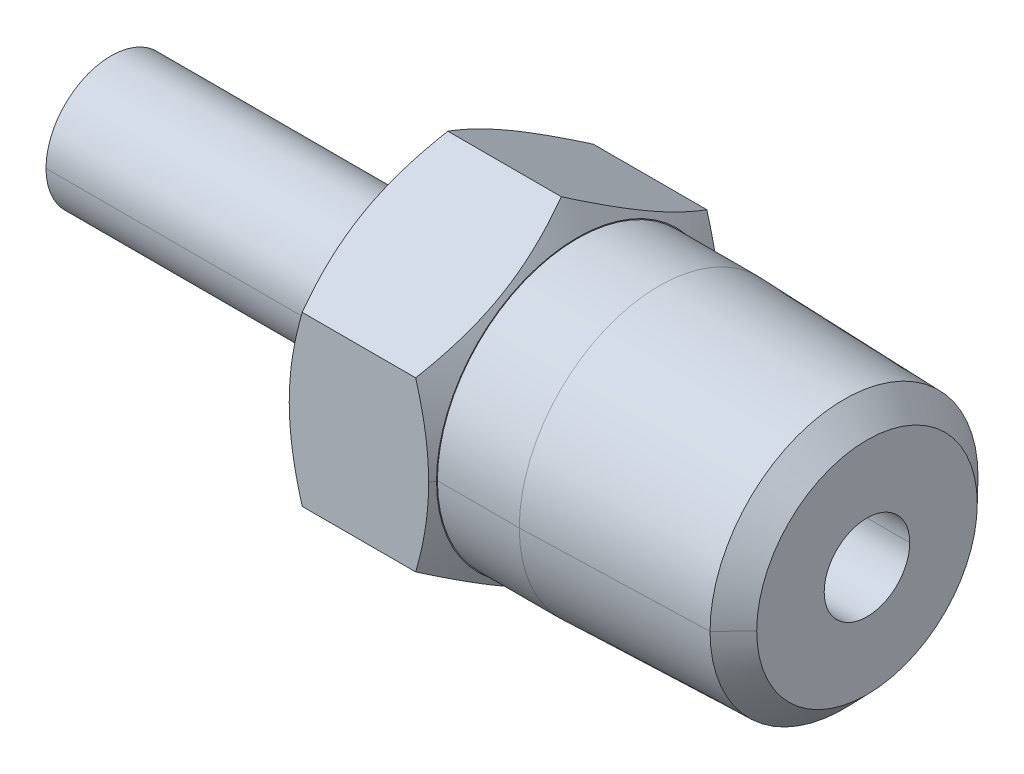
ISO-10303-21;
HEADER;
FILE_DESCRIPTION(('STEP AP214'),'2;1');
FILE_NAME('part.step','',(''),(''),'','','');
FILE_SCHEMA(('AUTOMOTIVE_DESIGN { 1 0 10303 214 1 1 1 1 }'));
ENDSEC;
DATA;
#1=APPLICATION_CONTEXT('core data for automotive mechanical design processes');
#2=APPLICATION_PROTOCOL_DEFINITION('international standard','automotive_design',2000,#1);
#3=PRODUCT_CONTEXT('',#1,'mechanical');
#4=PRODUCT('Part','Part','',(#3));
#5=PRODUCT_RELATED_PRODUCT_CATEGORY('part','',(#4));
#6=PRODUCT_DEFINITION_FORMATION('','',#4);
#7=PRODUCT_DEFINITION_CONTEXT('part definition',#1,'design');
#8=PRODUCT_DEFINITION('design','',#6,#7);
#9=PRODUCT_DEFINITION_SHAPE('','',#8);
#10=(LENGTH_UNIT() NAMED_UNIT(*) SI_UNIT(.MILLI.,.METRE.));
#11=(NAMED_UNIT(*) PLANE_ANGLE_UNIT() SI_UNIT($,.RADIAN.));
#12=(NAMED_UNIT(*) SI_UNIT($,.STERADIAN.) SOLID_ANGLE_UNIT());
#13=UNCERTAINTY_MEASURE_WITH_UNIT(LENGTH_MEASURE(1.E-05),#10,'distance_accuracy_value','');
#14=(GEOMETRIC_REPRESENTATION_CONTEXT(3) GLOBAL_UNCERTAINTY_ASSIGNED_CONTEXT((#13)) GLOBAL_UNIT_ASSIGNED_CONTEXT((#10,
#11,#12)) REPRESENTATION_CONTEXT('',''));
#15=CARTESIAN_POINT('',(0.,0.,0.));
#16=DIRECTION('',(0.,0.,1.));
#17=DIRECTION('',(1.,0.,0.));
#18=AXIS2_PLACEMENT_3D('',#15,#16,#17);
#19=CARTESIAN_POINT('',(0.,-4.12516767335987,7.145));
#20=DIRECTION('',(0.,-0.866025403784439,0.5));
#21=DIRECTION('',(-1.,0.,0.));
#22=AXIS2_PLACEMENT_3D('',#19,#20,#21);
#23=PLANE('',#22);
#24=CARTESIAN_POINT('',(16.5296164759249,-4.12516767335987,7.145));
#25=CARTESIAN_POINT('',(16.2204855706598,-4.66059810746739,6.21760728420712));
#26=CARTESIAN_POINT('',(16.0639197776998,-5.14395831425443,5.38040284769497));
#27=CARTESIAN_POINT('',(15.8921481330481,-5.67426302583439,4.46188814374532));
#28=CARTESIAN_POINT('',(15.8914533259331,-6.18381055232482,3.57932593899285));
#29=CARTESIAN_POINT('',(15.8907556166952,-6.69548639556823,2.69307738148961));
#30=CARTESIAN_POINT('',(16.0630966316208,-7.22899997684672,1.76900475218724));
#31=CARTESIAN_POINT('',(16.2195163074295,-7.71322609945068,0.930300505485105));
#32=CARTESIAN_POINT('',(16.5296164759249,-8.25033534671975,0.));
#33=B_SPLINE_CURVE_WITH_KNOTS('',2,(#24,#25,#26,#27,#28,#29,#30,#31,#32),.UNSPECIFIED.,.F.,.F.,
(3,2,2,2,3),(0.,0.25,0.5,0.75,1.),.UNSPECIFIED.);
#34=CARTESIAN_POINT('',(16.5296164759249,-4.12516767335987,7.145));
#35=VERTEX_POINT('',#34);
#36=CARTESIAN_POINT('',(16.5296164759249,-8.25033534671975,0.));
#37=VERTEX_POINT('',#36);
#38=EDGE_CURVE('E527',#35,#37,#33,.T.);
#39=ORIENTED_EDGE('',*,*,#38,.T.);
#40=DIRECTION('',(1.,0.,0.));
#41=VECTOR('',#40,1.);
#42=CARTESIAN_POINT('',(0.,-8.25033534671975,0.));
#43=LINE('',#42,#41);
#44=CARTESIAN_POINT('',(22.0963835240751,-8.25033534671975,0.));
#45=VERTEX_POINT('',#44);
#46=EDGE_CURVE('E10',#37,#45,#43,.T.);
#47=ORIENTED_EDGE('',*,*,#46,.T.);
#48=CARTESIAN_POINT('',(22.0963835240751,-8.25033534671975,0.));
#49=CARTESIAN_POINT('',(22.405514429361,-7.71490491257609,0.927392715855481));
#50=CARTESIAN_POINT('',(22.5620802223002,-7.2315447058252,1.76459715230502));
#51=CARTESIAN_POINT('',(22.7338518669617,-6.70123999418403,2.68311185636069));
#52=CARTESIAN_POINT('',(22.7345466740668,-6.19169246775481,3.56567406100714));
#53=CARTESIAN_POINT('',(22.7352443832952,-5.68001662445924,4.45192261860071));
#54=CARTESIAN_POINT('',(22.5629033683791,-5.14650304323291,5.37599524781275));
#55=CARTESIAN_POINT('',(22.4064836925557,-4.66227692060334,6.21469949455924));
#56=CARTESIAN_POINT('',(22.0963835240751,-4.12516767335987,7.145));
#57=B_SPLINE_CURVE_WITH_KNOTS('',2,(#48,#49,#50,#51,#52,#53,#54,#55,#56),.UNSPECIFIED.,.F.,.F.,
(3,2,2,2,3),(0.,0.25,0.5,0.75,1.),.UNSPECIFIED.);
#58=CARTESIAN_POINT('',(22.0963835240751,-4.12516767335987,7.145));
#59=VERTEX_POINT('',#58);
#60=EDGE_CURVE('E1067',#45,#59,#57,.T.);
#61=ORIENTED_EDGE('',*,*,#60,.T.);
#62=DIRECTION('',(1.,0.,0.));
#63=VECTOR('',#62,1.);
#64=CARTESIAN_POINT('',(0.,-4.12516767335987,7.145));
#65=LINE('',#64,#63);
#66=EDGE_CURVE('E438',#35,#59,#65,.T.);
#67=ORIENTED_EDGE('',*,*,#66,.F.);
#68=EDGE_LOOP('',(#39,#47,#61,#67));
#69=FACE_BOUND('',#68,.T.);
#70=ADVANCED_FACE('F16',(#69),#23,.T.);
#71=CARTESIAN_POINT('',(0.,-8.25033534671975,0.));
#72=DIRECTION('',(0.,-0.866025403784439,-0.5));
#73=DIRECTION('',(0.,0.5,-0.866025403784439));
#74=AXIS2_PLACEMENT_3D('',#71,#72,#73);
#75=PLANE('',#74);
#76=CARTESIAN_POINT('',(16.5296164759249,-8.25033534671975,0.));
#77=CARTESIAN_POINT('',(16.22048557066,-7.71490491261251,-0.927392715792402));
#78=CARTESIAN_POINT('',(16.0639197776998,-7.2315447058252,-1.76459715230502));
#79=CARTESIAN_POINT('',(15.8921481330416,-6.70123999422544,-2.68311185628897));
#80=CARTESIAN_POINT('',(15.8914533259332,-6.19169246775481,-3.56567406100714));
#81=CARTESIAN_POINT('',(15.8907556167016,-5.68001662449136,-4.45192261854508));
#82=CARTESIAN_POINT('',(16.0630966316208,-5.14650304323291,-5.37599524781275));
#83=CARTESIAN_POINT('',(16.2195163074295,-4.66227692062892,-6.21469949451493));
#84=CARTESIAN_POINT('',(16.5296164759249,-4.12516767335987,-7.14500000000001));
#85=B_SPLINE_CURVE_WITH_KNOTS('',2,(#76,#77,#78,#79,#80,#81,#82,#83,#84),.UNSPECIFIED.,.F.,.F.,
(3,2,2,2,3),(0.,0.25,0.5,0.75,1.),.UNSPECIFIED.);
#86=CARTESIAN_POINT('',(16.5296164759249,-4.12516767335987,-7.145));
#87=VERTEX_POINT('',#86);
#88=EDGE_CURVE('E266',#37,#87,#85,.T.);
#89=ORIENTED_EDGE('',*,*,#88,.T.);
#90=DIRECTION('',(1.,0.,0.));
#91=VECTOR('',#90,1.);
#92=CARTESIAN_POINT('',(0.,-4.12516767335987,-7.145));
#93=LINE('',#92,#91);
#94=CARTESIAN_POINT('',(22.0963835240751,-4.12516767335987,-7.145));
#95=VERTEX_POINT('',#94);
#96=EDGE_CURVE('E30',#87,#95,#93,.T.);
#97=ORIENTED_EDGE('',*,*,#96,.T.);
#98=CARTESIAN_POINT('',(22.0963835240751,-4.12516767335987,-7.14500000000001));
#99=CARTESIAN_POINT('',(22.4055144293611,-4.66059810750354,-6.2176072841445));
#100=CARTESIAN_POINT('',(22.5620802223003,-5.14395831425442,-5.38040284769498));
#101=CARTESIAN_POINT('',(22.7338518669552,-5.67426302587556,-4.46188814367401));
#102=CARTESIAN_POINT('',(22.7345466740669,-6.18381055232481,-3.57932593899285));
#103=CARTESIAN_POINT('',(22.7352443833016,-6.69548639557781,-2.69307738147301));
#104=CARTESIAN_POINT('',(22.5629033683792,-7.22899997684672,-1.76900475218724));
#105=CARTESIAN_POINT('',(22.4064836925708,-7.7132260994502,-0.930300505485926));
#106=CARTESIAN_POINT('',(22.0963835240751,-8.25033534671975,0.));
#107=B_SPLINE_CURVE_WITH_KNOTS('',2,(#98,#99,#100,#101,#102,#103,#104,#105,#106),.UNSPECIFIED.,
.F.,.F.,(3,2,2,2,3),(0.,0.25,0.5,0.75,1.),.UNSPECIFIED.);
#108=EDGE_CURVE('E187',#95,#45,#107,.T.);
#109=ORIENTED_EDGE('',*,*,#108,.T.);
#110=ORIENTED_EDGE('',*,*,#46,.F.);
#111=EDGE_LOOP('',(#89,#97,#109,#110));
#112=FACE_BOUND('',#111,.T.);
#113=ADVANCED_FACE('F237',(#112),#75,.T.);
#114=CARTESIAN_POINT('',(0.,-4.12516767335987,-7.145));
#115=DIRECTION('',(0.,0.,-1.));
#116=DIRECTION('',(-1.,0.,0.));
#117=AXIS2_PLACEMENT_3D('',#114,#115,#116);
#118=PLANE('',#117);
#119=CARTESIAN_POINT('',(16.5296164759249,-4.12516767335987,-7.145));
#120=CARTESIAN_POINT('',(16.2190473357358,-3.04932461321923,-7.145));
#121=CARTESIAN_POINT('',(16.062440766581,-2.07843354247556,-7.145));
#122=CARTESIAN_POINT('',(15.8914508159514,-1.01837190426317,-7.145));
#123=CARTESIAN_POINT('',(15.8914508159514,0.,-7.145));
#124=B_SPLINE_CURVE_WITH_KNOTS('',2,(#119,#120,#121,#122,#123),.UNSPECIFIED.,.F.,.F.,(3,2,3),
(0.,0.5,1.),.UNSPECIFIED.);
#125=CARTESIAN_POINT('',(15.8914508159514,0.,-7.145));
#126=VERTEX_POINT('',#125);
#127=EDGE_CURVE('E276',#87,#126,#124,.T.);
#128=ORIENTED_EDGE('',*,*,#127,.T.);
#129=CARTESIAN_POINT('',(15.8914508159514,0.,-7.145));
#130=CARTESIAN_POINT('',(15.8914508159514,1.02505278060319,-7.145));
#131=CARTESIAN_POINT('',(16.0649185019962,2.09374613059247,-7.145));
#132=CARTESIAN_POINT('',(16.2212824043129,3.05706711788696,-7.145));
#133=CARTESIAN_POINT('',(16.5296164759249,4.12516767335989,-7.145));
#134=B_SPLINE_CURVE_WITH_KNOTS('',2,(#129,#130,#131,#132,#133),.UNSPECIFIED.,.F.,.F.,(3,2,3),
(0.,0.5,1.),.UNSPECIFIED.);
#135=CARTESIAN_POINT('',(16.5296164759249,4.12516767335988,-7.145));
#136=VERTEX_POINT('',#135);
#137=EDGE_CURVE('E319',#126,#136,#134,.T.);
#138=ORIENTED_EDGE('',*,*,#137,.T.);
#139=DIRECTION('',(1.,0.,0.));
#140=VECTOR('',#139,1.);
#141=CARTESIAN_POINT('',(0.,4.12516767335988,-7.145));
#142=LINE('',#141,#140);
#143=CARTESIAN_POINT('',(22.0963835240751,4.12516767335988,-7.145));
#144=VERTEX_POINT('',#143);
#145=EDGE_CURVE('E201',#136,#144,#142,.T.);
#146=ORIENTED_EDGE('',*,*,#145,.T.);
#147=CARTESIAN_POINT('',(22.0963835240751,4.12516767335989,-7.145));
#148=CARTESIAN_POINT('',(22.4045460004169,3.05766154133951,-7.145));
#149=CARTESIAN_POINT('',(22.5610814980038,2.09374613059247,-7.145));
#150=CARTESIAN_POINT('',(22.7345491840486,1.02556556821066,-7.145));
#151=CARTESIAN_POINT('',(22.7345491840486,0.,-7.145));
#152=B_SPLINE_CURVE_WITH_KNOTS('',2,(#147,#148,#149,#150,#151),.UNSPECIFIED.,.F.,.F.,(3,2,3),
(0.,0.5,1.),.UNSPECIFIED.);
#153=CARTESIAN_POINT('',(22.7345491840486,0.,-7.145));
#154=VERTEX_POINT('',#153);
#155=EDGE_CURVE('E196',#144,#154,#152,.T.);
#156=ORIENTED_EDGE('',*,*,#155,.T.);
#157=CARTESIAN_POINT('',(22.7345491840486,0.,-7.145));
#158=CARTESIAN_POINT('',(22.7345491840486,-1.0178595119256,-7.145));
#159=CARTESIAN_POINT('',(22.563559233419,-2.07843354247556,-7.145));
#160=CARTESIAN_POINT('',(22.407124035199,-3.04873096688701,-7.145));
#161=CARTESIAN_POINT('',(22.0963835240751,-4.12516767335987,-7.145));
#162=B_SPLINE_CURVE_WITH_KNOTS('',2,(#157,#158,#159,#160,#161),.UNSPECIFIED.,.F.,.F.,(3,2,3),
(0.,0.5,1.),.UNSPECIFIED.);
#163=EDGE_CURVE('E179',#154,#95,#162,.T.);
#164=ORIENTED_EDGE('',*,*,#163,.T.);
#165=ORIENTED_EDGE('',*,*,#96,.F.);
#166=EDGE_LOOP('',(#128,#138,#146,#156,#164,#165));
#167=FACE_BOUND('',#166,.T.);
#168=ADVANCED_FACE('F199',(#167),#118,.T.);
#169=CARTESIAN_POINT('',(0.,4.12516767335988,-7.145));
#170=DIRECTION('',(0.,0.866025403784439,-0.5));
#171=DIRECTION('',(-1.,0.,0.));
#172=AXIS2_PLACEMENT_3D('',#169,#170,#171);
#173=PLANE('',#172);
#174=CARTESIAN_POINT('',(16.5296164759249,4.12516767335988,-7.145));
#175=CARTESIAN_POINT('',(16.2204855706458,4.66059810749161,-6.21760728416518));
#176=CARTESIAN_POINT('',(16.0639197776998,5.14395831425443,-5.38040284769498));
#177=CARTESIAN_POINT('',(15.8921481330448,5.67426302586533,-4.46188814369174));
#178=CARTESIAN_POINT('',(15.8914533259331,6.18381055232482,-3.57932593899286));
#179=CARTESIAN_POINT('',(15.8907556166984,6.69548639557825,-2.69307738147227));
#180=CARTESIAN_POINT('',(16.0630966316208,7.22899997684672,-1.76900475218725));
#181=CARTESIAN_POINT('',(16.2195163074295,7.71322609945068,-0.930300505485113));
#182=CARTESIAN_POINT('',(16.5296164759249,8.25033534671975,0.));
#183=B_SPLINE_CURVE_WITH_KNOTS('',2,(#174,#175,#176,#177,#178,#179,#180,#181,#182),
.UNSPECIFIED.,.F.,.F.,(3,2,2,2,3),(0.,0.25,0.5,0.75,1.),.UNSPECIFIED.);
#184=CARTESIAN_POINT('',(16.5296164759249,8.25033534671976,0.));
#185=VERTEX_POINT('',#184);
#186=EDGE_CURVE('E336',#136,#185,#183,.T.);
#187=ORIENTED_EDGE('',*,*,#186,.T.);
#188=DIRECTION('',(1.,0.,0.));
#189=VECTOR('',#188,1.);
#190=CARTESIAN_POINT('',(0.,8.25033534671976,0.));
#191=LINE('',#190,#189);
#192=CARTESIAN_POINT('',(22.0963835240751,8.25033534671976,0.));
#193=VERTEX_POINT('',#192);
#194=EDGE_CURVE('E330',#185,#193,#191,.T.);
#195=ORIENTED_EDGE('',*,*,#194,.T.);
#196=CARTESIAN_POINT('',(22.0963835240751,8.25033534671975,0.));
#197=CARTESIAN_POINT('',(22.4055144293394,7.7149049126137,-0.927392715790347));
#198=CARTESIAN_POINT('',(22.5620802223002,7.2315447058252,-1.76459715230502));
#199=CARTESIAN_POINT('',(22.7338518669649,6.70123999420648,-2.68311185632181));
#200=CARTESIAN_POINT('',(22.7345466740668,6.19169246775481,-3.56567406100714));
#201=CARTESIAN_POINT('',(22.7352443832919,5.68001662447135,-4.45192261857976));
#202=CARTESIAN_POINT('',(22.5629033683792,5.14650304323292,-5.37599524781275));
#203=CARTESIAN_POINT('',(22.4064836925705,4.66227692062899,-6.21469949451483));
#204=CARTESIAN_POINT('',(22.0963835240751,4.12516767335988,-7.145));
#205=B_SPLINE_CURVE_WITH_KNOTS('',2,(#196,#197,#198,#199,#200,#201,#202,#203,#204),
.UNSPECIFIED.,.F.,.F.,(3,2,2,2,3),(0.,0.25,0.5,0.75,1.),.UNSPECIFIED.);
#206=EDGE_CURVE('E206',#193,#144,#205,.T.);
#207=ORIENTED_EDGE('',*,*,#206,.T.);
#208=ORIENTED_EDGE('',*,*,#145,.F.);
#209=EDGE_LOOP('',(#187,#195,#207,#208));
#210=FACE_BOUND('',#209,.T.);
#211=ADVANCED_FACE('F292',(#210),#173,.T.);
#212=CARTESIAN_POINT('',(0.,8.25033534671976,0.));
#213=DIRECTION('',(0.,0.866025403784439,0.5));
#214=DIRECTION('',(1.,0.,0.));
#215=AXIS2_PLACEMENT_3D('',#212,#213,#214);
#216=PLANE('',#215);
#217=CARTESIAN_POINT('',(16.5296164759249,8.25033534671976,0.));
#218=CARTESIAN_POINT('',(16.2204855706601,7.71490491261278,0.927392715791948));
#219=CARTESIAN_POINT('',(16.0639197776998,7.23154470582521,1.76459715230502));
#220=CARTESIAN_POINT('',(15.8921481330416,6.70123999422563,2.68311185628866));
#221=CARTESIAN_POINT('',(15.8914533259331,6.19169246775482,3.56567406100714));
#222=CARTESIAN_POINT('',(15.8907556167016,5.68001662448075,4.45192261856348));
#223=CARTESIAN_POINT('',(16.0630966316208,5.14650304323292,5.37599524781275));
#224=CARTESIAN_POINT('',(16.2195163074366,4.66227692061661,6.21469949453628));
#225=CARTESIAN_POINT('',(16.5296164759249,4.12516767335988,7.14500000000001));
#226=B_SPLINE_CURVE_WITH_KNOTS('',2,(#217,#218,#219,#220,#221,#222,#223,#224,#225),
.UNSPECIFIED.,.F.,.F.,(3,2,2,2,3),(0.,0.25,0.5,0.75,1.),.UNSPECIFIED.);
#227=CARTESIAN_POINT('',(16.5296164759249,4.12516767335987,7.145));
#228=VERTEX_POINT('',#227);
#229=EDGE_CURVE('E446',#185,#228,#226,.T.);
#230=ORIENTED_EDGE('',*,*,#229,.T.);
#231=DIRECTION('',(1.,0.,0.));
#232=VECTOR('',#231,1.);
#233=CARTESIAN_POINT('',(0.,4.12516767335987,7.145));
#234=LINE('',#233,#232);
#235=CARTESIAN_POINT('',(22.0963835240751,4.12516767335987,7.145));
#236=VERTEX_POINT('',#235);
#237=EDGE_CURVE('E416',#228,#236,#234,.T.);
#238=ORIENTED_EDGE('',*,*,#237,.T.);
#239=CARTESIAN_POINT('',(22.0963835240751,4.12516767335988,7.14500000000001));
#240=CARTESIAN_POINT('',(22.4055144293328,4.66059810745456,6.21760728422936));
#241=CARTESIAN_POINT('',(22.5620802223002,5.14395831425444,5.38040284769498));
#242=CARTESIAN_POINT('',(22.7338518669617,5.67426302585334,4.46188814371251));
#243=CARTESIAN_POINT('',(22.7345466740668,6.18381055232482,3.57932593899286));
#244=CARTESIAN_POINT('',(22.7352443832952,6.69548639561952,2.69307738140079));
#245=CARTESIAN_POINT('',(22.5629033683791,7.22899997684673,1.76900475218725));
#246=CARTESIAN_POINT('',(22.4064836925563,7.71322609947525,0.930300505442559));
#247=CARTESIAN_POINT('',(22.0963835240751,8.25033534671976,0.));
#248=B_SPLINE_CURVE_WITH_KNOTS('',2,(#239,#240,#241,#242,#243,#244,#245,#246,#247),
.UNSPECIFIED.,.F.,.F.,(3,2,2,2,3),(0.,0.25,0.5,0.75,1.),.UNSPECIFIED.);
#249=EDGE_CURVE('E405',#236,#193,#248,.T.);
#250=ORIENTED_EDGE('',*,*,#249,.T.);
#251=ORIENTED_EDGE('',*,*,#194,.F.);
#252=EDGE_LOOP('',(#230,#238,#250,#251));
#253=FACE_BOUND('',#252,.T.);
#254=ADVANCED_FACE('F352',(#253),#216,.T.);
#255=CARTESIAN_POINT('',(0.,4.12516767335987,7.145));
#256=DIRECTION('',(0.,0.,1.));
#257=DIRECTION('',(1.,0.,0.));
#258=AXIS2_PLACEMENT_3D('',#255,#256,#257);
#259=PLANE('',#258);
#260=CARTESIAN_POINT('',(16.5296164759249,4.12516767335987,7.145));
#261=CARTESIAN_POINT('',(16.221453999576,3.0576615413149,7.145));
#262=CARTESIAN_POINT('',(16.0649185019962,2.09374613059247,7.145));
#263=CARTESIAN_POINT('',(15.8914508159514,1.0255655681893,7.145));
#264=CARTESIAN_POINT('',(15.8914508159514,0.,7.145));
#265=B_SPLINE_CURVE_WITH_KNOTS('',2,(#260,#261,#262,#263,#264),.UNSPECIFIED.,.F.,.F.,(3,2,3),
(0.,0.5,1.),.UNSPECIFIED.);
#266=CARTESIAN_POINT('',(15.8914508159514,0.,7.145));
#267=VERTEX_POINT('',#266);
#268=EDGE_CURVE('E471',#228,#267,#265,.T.);
#269=ORIENTED_EDGE('',*,*,#268,.T.);
#270=CARTESIAN_POINT('',(15.8914508159514,0.,7.145));
#271=CARTESIAN_POINT('',(15.8914508159514,-1.01785951192688,7.145));
#272=CARTESIAN_POINT('',(16.062440766581,-2.07843354247556,7.145));
#273=CARTESIAN_POINT('',(16.2188759648015,-3.04873096688853,7.145));
#274=CARTESIAN_POINT('',(16.5296164759249,-4.12516767335987,7.145));
#275=B_SPLINE_CURVE_WITH_KNOTS('',2,(#270,#271,#272,#273,#274),.UNSPECIFIED.,.F.,.F.,(3,2,3),
(0.,0.5,1.),.UNSPECIFIED.);
#276=EDGE_CURVE('E509',#267,#35,#275,.T.);
#277=ORIENTED_EDGE('',*,*,#276,.T.);
#278=ORIENTED_EDGE('',*,*,#66,.T.);
#279=CARTESIAN_POINT('',(22.0963835240751,-4.12516767335987,7.145));
#280=CARTESIAN_POINT('',(22.4069526642855,-3.04932461314514,7.145));
#281=CARTESIAN_POINT('',(22.563559233419,-2.07843354247556,7.145));
#282=CARTESIAN_POINT('',(22.7345491840486,-1.01837190419937,7.145));
#283=CARTESIAN_POINT('',(22.7345491840486,0.,7.145));
#284=B_SPLINE_CURVE_WITH_KNOTS('',2,(#279,#280,#281,#282,#283),.UNSPECIFIED.,.F.,.F.,(3,2,3),
(0.,0.5,1.),.UNSPECIFIED.);
#285=CARTESIAN_POINT('',(22.7345491840486,0.,7.145));
#286=VERTEX_POINT('',#285);
#287=EDGE_CURVE('E643',#59,#286,#284,.T.);
#288=ORIENTED_EDGE('',*,*,#287,.T.);
#289=CARTESIAN_POINT('',(22.7345491840486,0.,7.145));
#290=CARTESIAN_POINT('',(22.7345491840486,1.02505278060313,7.145));
#291=CARTESIAN_POINT('',(22.5610814980038,2.09374613059247,7.145));
#292=CARTESIAN_POINT('',(22.404717595687,3.0570671178868,7.145));
#293=CARTESIAN_POINT('',(22.0963835240751,4.12516767335987,7.145));
#294=B_SPLINE_CURVE_WITH_KNOTS('',2,(#289,#290,#291,#292,#293),.UNSPECIFIED.,.F.,.F.,(3,2,3),
(0.,0.5,1.),.UNSPECIFIED.);
#295=EDGE_CURVE('E419',#286,#236,#294,.T.);
#296=ORIENTED_EDGE('',*,*,#295,.T.);
#297=ORIENTED_EDGE('',*,*,#237,.F.);
#298=EDGE_LOOP('',(#269,#277,#278,#288,#296,#297));
#299=FACE_BOUND('',#298,.T.);
#300=ADVANCED_FACE('F477',(#299),#259,.T.);
#301=CARTESIAN_POINT('',(15.75,6.9,0.));
#302=DIRECTION('',(1.,0.,0.));
#303=DIRECTION('',(0.,1.,0.));
#304=AXIS2_PLACEMENT_3D('',#301,#302,#303);
#305=PLANE('',#304);
#306=CARTESIAN_POINT('',(15.75,0.,0.));
#307=DIRECTION('',(-1.,0.,0.));
#308=DIRECTION('',(0.,0.,1.));
#309=AXIS2_PLACEMENT_3D('',#306,#307,#308);
#310=CIRCLE('',#309,3.19);
#311=CARTESIAN_POINT('',(15.75,0.,3.19));
#312=VERTEX_POINT('',#311);
#313=CARTESIAN_POINT('',(15.75,0.,-3.19));
#314=VERTEX_POINT('',#313);
#315=EDGE_CURVE('E597',#312,#314,#310,.T.);
#316=ORIENTED_EDGE('',*,*,#315,.F.);
#317=CARTESIAN_POINT('',(15.75,0.,0.));
#318=DIRECTION('',(-1.,0.,0.));
#319=DIRECTION('',(0.,0.,1.));
#320=AXIS2_PLACEMENT_3D('',#317,#318,#319);
#321=CIRCLE('',#320,3.19);
#322=EDGE_CURVE('E662',#314,#312,#321,.T.);
#323=ORIENTED_EDGE('',*,*,#322,.F.);
#324=EDGE_LOOP('',(#316,#323));
#325=FACE_BOUND('',#324,.T.);
#326=CARTESIAN_POINT('',(15.75,0.,0.));
#327=DIRECTION('',(-1.,0.,0.));
#328=DIRECTION('',(0.,0.,1.));
#329=AXIS2_PLACEMENT_3D('',#326,#327,#328);
#330=CIRCLE('',#329,6.9);
#331=CARTESIAN_POINT('',(15.75,0.,-6.9));
#332=VERTEX_POINT('',#331);
#333=CARTESIAN_POINT('',(15.75,0.,6.9));
#334=VERTEX_POINT('',#333);
#335=EDGE_CURVE('E552',#332,#334,#330,.T.);
#336=ORIENTED_EDGE('',*,*,#335,.T.);
#337=CARTESIAN_POINT('',(15.75,0.,0.));
#338=DIRECTION('',(-1.,0.,0.));
#339=DIRECTION('',(0.,0.,1.));
#340=AXIS2_PLACEMENT_3D('',#337,#338,#339);
#341=CIRCLE('',#340,6.9);
#342=EDGE_CURVE('E521',#334,#332,#341,.T.);
#343=ORIENTED_EDGE('',*,*,#342,.T.);
#344=EDGE_LOOP('',(#336,#343));
#345=FACE_BOUND('',#344,.T.);
#346=ADVANCED_FACE('F485',(#325,#345),#305,.F.);
#347=CARTESIAN_POINT('',(0.,0.,0.));
#348=DIRECTION('',(-1.,0.,0.));
#349=DIRECTION('',(0.,0.,1.));
#350=AXIS2_PLACEMENT_3D('',#347,#348,#349);
#351=CYLINDRICAL_SURFACE('',#350,3.19);
#352=DIRECTION('',(-1.,0.,0.));
#353=VECTOR('',#352,1.);
#354=CARTESIAN_POINT('',(0.,0.,-3.19));
#355=LINE('',#354,#353);
#356=CARTESIAN_POINT('',(0.,0.,-3.19));
#357=VERTEX_POINT('',#356);
#358=EDGE_CURVE('E601',#314,#357,#355,.T.);
#359=ORIENTED_EDGE('',*,*,#358,.F.);
#360=ORIENTED_EDGE('',*,*,#322,.T.);
#361=DIRECTION('',(-1.,0.,0.));
#362=VECTOR('',#361,1.);
#363=CARTESIAN_POINT('',(0.,0.,3.19));
#364=LINE('',#363,#362);
#365=CARTESIAN_POINT('',(0.,0.,3.19));
#366=VERTEX_POINT('',#365);
#367=EDGE_CURVE('E591',#312,#366,#364,.T.);
#368=ORIENTED_EDGE('',*,*,#367,.T.);
#369=CARTESIAN_POINT('',(0.,0.,0.));
#370=DIRECTION('',(-1.,0.,0.));
#371=DIRECTION('',(0.,0.,1.));
#372=AXIS2_PLACEMENT_3D('',#369,#370,#371);
#373=CIRCLE('',#372,3.19);
#374=EDGE_CURVE('E582',#357,#366,#373,.T.);
#375=ORIENTED_EDGE('',*,*,#374,.F.);
#376=EDGE_LOOP('',(#359,#360,#368,#375));
#377=FACE_BOUND('',#376,.T.);
#378=ADVANCED_FACE('F384',(#377),#351,.T.);
#379=CARTESIAN_POINT('',(0.,3.19,0.));
#380=DIRECTION('',(1.,0.,0.));
#381=DIRECTION('',(0.,1.,0.));
#382=AXIS2_PLACEMENT_3D('',#379,#380,#381);
#383=PLANE('',#382);
#384=CARTESIAN_POINT('',(0.,0.,0.));
#385=DIRECTION('',(-1.,0.,0.));
#386=DIRECTION('',(0.,0.,1.));
#387=AXIS2_PLACEMENT_3D('',#384,#385,#386);
#388=CIRCLE('',#387,2.1);
#389=CARTESIAN_POINT('',(0.,0.,2.1));
#390=VERTEX_POINT('',#389);
#391=CARTESIAN_POINT('',(0.,0.,-2.1));
#392=VERTEX_POINT('',#391);
#393=EDGE_CURVE('E579',#390,#392,#388,.T.);
#394=ORIENTED_EDGE('',*,*,#393,.F.);
#395=CARTESIAN_POINT('',(0.,0.,0.));
#396=DIRECTION('',(-1.,0.,0.));
#397=DIRECTION('',(0.,0.,1.));
#398=AXIS2_PLACEMENT_3D('',#395,#396,#397);
#399=CIRCLE('',#398,2.1);
#400=EDGE_CURVE('E573',#392,#390,#399,.T.);
#401=ORIENTED_EDGE('',*,*,#400,.F.);
#402=EDGE_LOOP('',(#394,#401));
#403=FACE_BOUND('',#402,.T.);
#404=CARTESIAN_POINT('',(0.,0.,0.));
#405=DIRECTION('',(-1.,0.,0.));
#406=DIRECTION('',(0.,0.,1.));
#407=AXIS2_PLACEMENT_3D('',#404,#405,#406);
#408=CIRCLE('',#407,3.19);
#409=EDGE_CURVE('E595',#366,#357,#408,.T.);
#410=ORIENTED_EDGE('',*,*,#409,.T.);
#411=ORIENTED_EDGE('',*,*,#374,.T.);
#412=EDGE_LOOP('',(#410,#411));
#413=FACE_BOUND('',#412,.T.);
#414=ADVANCED_FACE('F246',(#403,#413),#383,.F.);
#415=CARTESIAN_POINT('',(0.,0.,0.));
#416=DIRECTION('',(-1.,0.,0.));
#417=DIRECTION('',(0.,0.,1.));
#418=AXIS2_PLACEMENT_3D('',#415,#416,#417);
#419=CYLINDRICAL_SURFACE('',#418,2.1);
#420=DIRECTION('',(-1.,0.,0.));
#421=VECTOR('',#420,1.);
#422=CARTESIAN_POINT('',(0.,0.,-2.1));
#423=LINE('',#422,#421);
#424=CARTESIAN_POINT('',(37.1,0.,-2.1));
#425=VERTEX_POINT('',#424);
#426=EDGE_CURVE('E578',#425,#392,#423,.T.);
#427=ORIENTED_EDGE('',*,*,#426,.F.);
#428=CARTESIAN_POINT('',(37.1,0.,0.));
#429=DIRECTION('',(-1.,0.,0.));
#430=DIRECTION('',(0.,0.,1.));
#431=AXIS2_PLACEMENT_3D('',#428,#429,#430);
#432=CIRCLE('',#431,2.1);
#433=CARTESIAN_POINT('',(37.1,0.,2.1));
#434=VERTEX_POINT('',#433);
#435=EDGE_CURVE('E583',#434,#425,#432,.T.);
#436=ORIENTED_EDGE('',*,*,#435,.F.);
#437=DIRECTION('',(-1.,0.,0.));
#438=VECTOR('',#437,1.);
#439=CARTESIAN_POINT('',(0.,0.,2.1));
#440=LINE('',#439,#438);
#441=EDGE_CURVE('E577',#434,#390,#440,.T.);
#442=ORIENTED_EDGE('',*,*,#441,.T.);
#443=ORIENTED_EDGE('',*,*,#393,.T.);
#444=EDGE_LOOP('',(#427,#436,#442,#443));
#445=FACE_BOUND('',#444,.T.);
#446=ADVANCED_FACE('F735',(#445),#419,.F.);
#447=CARTESIAN_POINT('',(37.1,5.41248395658529,0.));
#448=DIRECTION('',(-1.,0.,0.));
#449=DIRECTION('',(0.,0.,1.));
#450=AXIS2_PLACEMENT_3D('',#447,#448,#449);
#451=PLANE('',#450);
#452=ORIENTED_EDGE('',*,*,#435,.T.);
#453=CARTESIAN_POINT('',(37.1,0.,0.));
#454=DIRECTION('',(-1.,0.,0.));
#455=DIRECTION('',(0.,0.,1.));
#456=AXIS2_PLACEMENT_3D('',#453,#454,#455);
#457=CIRCLE('',#456,2.1);
#458=EDGE_CURVE('E594',#425,#434,#457,.T.);
#459=ORIENTED_EDGE('',*,*,#458,.T.);
#460=EDGE_LOOP('',(#452,#459));
#461=FACE_BOUND('',#460,.T.);
#462=CARTESIAN_POINT('',(37.1,0.,0.));
#463=DIRECTION('',(-1.,0.,0.));
#464=DIRECTION('',(0.,0.,1.));
#465=AXIS2_PLACEMENT_3D('',#462,#463,#464);
#466=CIRCLE('',#465,5.41248395658529);
#467=CARTESIAN_POINT('',(37.1,0.,5.41248395658529));
#468=VERTEX_POINT('',#467);
#469=CARTESIAN_POINT('',(37.1,0.,-5.41248395658529));
#470=VERTEX_POINT('',#469);
#471=EDGE_CURVE('E621',#468,#470,#466,.T.);
#472=ORIENTED_EDGE('',*,*,#471,.F.);
#473=CARTESIAN_POINT('',(37.1,0.,0.));
#474=DIRECTION('',(-1.,0.,0.));
#475=DIRECTION('',(0.,0.,1.));
#476=AXIS2_PLACEMENT_3D('',#473,#474,#475);
#477=CIRCLE('',#476,5.41248395658529);
#478=EDGE_CURVE('E590',#470,#468,#477,.T.);
#479=ORIENTED_EDGE('',*,*,#478,.F.);
#480=EDGE_LOOP('',(#472,#479));
#481=FACE_BOUND('',#480,.T.);
#482=ADVANCED_FACE('F293',(#461,#481),#451,.F.);
#483=CARTESIAN_POINT('',(37.1,0.,0.));
#484=DIRECTION('',(-1.,0.,0.));
#485=DIRECTION('',(0.,0.,1.));
#486=AXIS2_PLACEMENT_3D('',#483,#484,#485);
#487=CONICAL_SURFACE('',#486,5.41248395658529,0.800960682561064);
#488=DIRECTION('',(-0.696017236467457,0.,-0.718025073754535));
#489=VECTOR('',#488,1.);
#490=CARTESIAN_POINT('',(37.1,0.,-5.41248395658529));
#491=LINE('',#490,#489);
#492=CARTESIAN_POINT('',(35.9727862248067,0.,-6.57533986253685));
#493=VERTEX_POINT('',#492);
#494=EDGE_CURVE('E615',#470,#493,#491,.T.);
#495=ORIENTED_EDGE('',*,*,#494,.F.);
#496=ORIENTED_EDGE('',*,*,#478,.T.);
#497=DIRECTION('',(-0.696017236467457,0.,0.718025073754535));
#498=VECTOR('',#497,1.);
#499=CARTESIAN_POINT('',(37.1,0.,5.41248395658529));
#500=LINE('',#499,#498);
#501=CARTESIAN_POINT('',(35.9727862248067,0.,6.57533986253685));
#502=VERTEX_POINT('',#501);
#503=EDGE_CURVE('E614',#468,#502,#500,.T.);
#504=ORIENTED_EDGE('',*,*,#503,.T.);
#505=CARTESIAN_POINT('',(35.9727862248067,0.,0.));
#506=DIRECTION('',(-1.,0.,0.));
#507=DIRECTION('',(0.,0.,1.));
#508=AXIS2_PLACEMENT_3D('',#505,#506,#507);
#509=CIRCLE('',#508,6.57533986253685);
#510=EDGE_CURVE('E609',#493,#502,#509,.T.);
#511=ORIENTED_EDGE('',*,*,#510,.F.);
#512=EDGE_LOOP('',(#495,#496,#504,#511));
#513=FACE_BOUND('',#512,.T.);
#514=ADVANCED_FACE('F754',(#513),#487,.T.);
#515=CARTESIAN_POINT('',(35.9727862248067,0.,0.));
#516=DIRECTION('',(-1.,0.,0.));
#517=DIRECTION('',(0.,0.,1.));
#518=AXIS2_PLACEMENT_3D('',#515,#516,#517);
#519=CONICAL_SURFACE('',#518,6.57533986253685,0.0311250383272335);
#520=DIRECTION('',(-0.999515655097946,0.,-0.0311200130804086));
#521=VECTOR('',#520,1.);
#522=CARTESIAN_POINT('',(35.9727862248067,0.,-6.57533986253685));
#523=LINE('',#522,#521);
#524=CARTESIAN_POINT('',(26.89428,0.,-6.858));
#525=VERTEX_POINT('',#524);
#526=EDGE_CURVE('E572',#493,#525,#523,.T.);
#527=ORIENTED_EDGE('',*,*,#526,.F.);
#528=ORIENTED_EDGE('',*,*,#510,.T.);
#529=DIRECTION('',(-0.999515655097946,0.,0.0311200130804086));
#530=VECTOR('',#529,1.);
#531=CARTESIAN_POINT('',(35.9727862248067,0.,6.57533986253685));
#532=LINE('',#531,#530);
#533=CARTESIAN_POINT('',(26.89428,0.,6.858));
#534=VERTEX_POINT('',#533);
#535=EDGE_CURVE('E571',#502,#534,#532,.T.);
#536=ORIENTED_EDGE('',*,*,#535,.T.);
#537=CARTESIAN_POINT('',(26.89428,0.,0.));
#538=DIRECTION('',(-1.,0.,0.));
#539=DIRECTION('',(0.,0.,1.));
#540=AXIS2_PLACEMENT_3D('',#537,#538,#539);
#541=CIRCLE('',#540,6.858);
#542=EDGE_CURVE('E626',#525,#534,#541,.T.);
#543=ORIENTED_EDGE('',*,*,#542,.F.);
#544=EDGE_LOOP('',(#527,#528,#536,#543));
#545=FACE_BOUND('',#544,.T.);
#546=ADVANCED_FACE('F355',(#545),#519,.T.);
#547=CARTESIAN_POINT('',(0.,0.,0.));
#548=DIRECTION('',(-1.,0.,0.));
#549=DIRECTION('',(0.,0.,1.));
#550=AXIS2_PLACEMENT_3D('',#547,#548,#549);
#551=CYLINDRICAL_SURFACE('',#550,6.858);
#552=DIRECTION('',(-1.,0.,0.));
#553=VECTOR('',#552,1.);
#554=CARTESIAN_POINT('',(0.,0.,-6.858));
#555=LINE('',#554,#553);
#556=CARTESIAN_POINT('',(22.876,0.,-6.858));
#557=VERTEX_POINT('',#556);
#558=EDGE_CURVE('E587',#525,#557,#555,.T.);
#559=ORIENTED_EDGE('',*,*,#558,.F.);
#560=ORIENTED_EDGE('',*,*,#542,.T.);
#561=DIRECTION('',(-1.,0.,0.));
#562=VECTOR('',#561,1.);
#563=CARTESIAN_POINT('',(0.,0.,6.858));
#564=LINE('',#563,#562);
#565=CARTESIAN_POINT('',(22.876,0.,6.858));
#566=VERTEX_POINT('',#565);
#567=EDGE_CURVE('E220',#534,#566,#564,.T.);
#568=ORIENTED_EDGE('',*,*,#567,.T.);
#569=CARTESIAN_POINT('',(22.876,0.,0.));
#570=DIRECTION('',(-1.,0.,0.));
#571=DIRECTION('',(0.,0.,1.));
#572=AXIS2_PLACEMENT_3D('',#569,#570,#571);
#573=CIRCLE('',#572,6.858);
#574=EDGE_CURVE('E192',#557,#566,#573,.T.);
#575=ORIENTED_EDGE('',*,*,#574,.F.);
#576=EDGE_LOOP('',(#559,#560,#568,#575));
#577=FACE_BOUND('',#576,.T.);
#578=ADVANCED_FACE('F773',(#577),#551,.T.);
#579=CARTESIAN_POINT('',(22.876,6.858,0.));
#580=DIRECTION('',(-1.,0.,0.));
#581=DIRECTION('',(0.,0.,1.));
#582=AXIS2_PLACEMENT_3D('',#579,#580,#581);
#583=PLANE('',#582);
#584=CARTESIAN_POINT('',(22.876,0.,0.));
#585=DIRECTION('',(-1.,0.,0.));
#586=DIRECTION('',(0.,0.,1.));
#587=AXIS2_PLACEMENT_3D('',#584,#585,#586);
#588=CIRCLE('',#587,6.858);
#589=EDGE_CURVE('E622',#566,#557,#588,.T.);
#590=ORIENTED_EDGE('',*,*,#589,.T.);
#591=ORIENTED_EDGE('',*,*,#574,.T.);
#592=EDGE_LOOP('',(#590,#591));
#593=FACE_BOUND('',#592,.T.);
#594=CARTESIAN_POINT('',(22.876,0.,0.));
#595=DIRECTION('',(-1.,0.,0.));
#596=DIRECTION('',(0.,0.,1.));
#597=AXIS2_PLACEMENT_3D('',#594,#595,#596);
#598=CIRCLE('',#597,6.9);
#599=CARTESIAN_POINT('',(22.876,0.,6.9));
#600=VERTEX_POINT('',#599);
#601=CARTESIAN_POINT('',(22.876,0.,-6.9));
#602=VERTEX_POINT('',#601);
#603=EDGE_CURVE('E212',#600,#602,#598,.T.);
#604=ORIENTED_EDGE('',*,*,#603,.F.);
#605=CARTESIAN_POINT('',(22.876,0.,0.));
#606=DIRECTION('',(-1.,0.,0.));
#607=DIRECTION('',(0.,0.,1.));
#608=AXIS2_PLACEMENT_3D('',#605,#606,#607);
#609=CIRCLE('',#608,6.9);
#610=EDGE_CURVE('E548',#602,#600,#609,.T.);
#611=ORIENTED_EDGE('',*,*,#610,.F.);
#612=EDGE_LOOP('',(#604,#611));
#613=FACE_BOUND('',#612,.T.);
#614=ADVANCED_FACE('F782',(#593,#613),#583,.F.);
#615=CARTESIAN_POINT('',(22.876,0.,0.));
#616=DIRECTION('',(-1.,0.,0.));
#617=DIRECTION('',(0.,0.,1.));
#618=AXIS2_PLACEMENT_3D('',#615,#616,#617);
#619=CONICAL_SURFACE('',#618,6.9,1.04719755119659);
#620=DIRECTION('',(-0.500000000000008,0.,-0.866025403784434));
#621=VECTOR('',#620,1.);
#622=CARTESIAN_POINT('',(22.876,0.,-6.9));
#623=LINE('',#622,#621);
#624=EDGE_CURVE('E184',#602,#154,#623,.T.);
#625=ORIENTED_EDGE('',*,*,#624,.F.);
#626=ORIENTED_EDGE('',*,*,#610,.T.);
#627=DIRECTION('',(-0.500000000000008,0.,0.866025403784434));
#628=VECTOR('',#627,1.);
#629=CARTESIAN_POINT('',(22.876,0.,6.9));
#630=LINE('',#629,#628);
#631=EDGE_CURVE('E425',#600,#286,#630,.T.);
#632=ORIENTED_EDGE('',*,*,#631,.T.);
#633=ORIENTED_EDGE('',*,*,#287,.F.);
#634=ORIENTED_EDGE('',*,*,#60,.F.);
#635=ORIENTED_EDGE('',*,*,#108,.F.);
#636=ORIENTED_EDGE('',*,*,#163,.F.);
#637=EDGE_LOOP('',(#625,#626,#632,#633,#634,#635,#636));
#638=FACE_BOUND('',#637,.T.);
#639=ADVANCED_FACE('F182',(#638),#619,.T.);
#640=CARTESIAN_POINT('',(19.313,0.,0.));
#641=DIRECTION('',(1.,0.,0.));
#642=DIRECTION('',(0.,0.,-1.));
#643=AXIS2_PLACEMENT_3D('',#640,#641,#642);
#644=CONICAL_SURFACE('',#643,13.0712970273679,1.0471975511966);
#645=DIRECTION('',(0.5,0.,0.866025403784442));
#646=VECTOR('',#645,1.);
#647=CARTESIAN_POINT('',(19.313,0.,13.0712970273679));
#648=LINE('',#647,#646);
#649=EDGE_CURVE('E513',#334,#267,#648,.T.);
#650=ORIENTED_EDGE('',*,*,#649,.F.);
#651=ORIENTED_EDGE('',*,*,#335,.F.);
#652=DIRECTION('',(0.5,0.,-0.866025403784442));
#653=VECTOR('',#652,1.);
#654=CARTESIAN_POINT('',(19.313,0.,-13.0712970273679));
#655=LINE('',#654,#653);
#656=EDGE_CURVE('E556',#332,#126,#655,.T.);
#657=ORIENTED_EDGE('',*,*,#656,.T.);
#658=ORIENTED_EDGE('',*,*,#127,.F.);
#659=ORIENTED_EDGE('',*,*,#88,.F.);
#660=ORIENTED_EDGE('',*,*,#38,.F.);
#661=ORIENTED_EDGE('',*,*,#276,.F.);
#662=EDGE_LOOP('',(#650,#651,#657,#658,#659,#660,#661));
#663=FACE_BOUND('',#662,.T.);
#664=ADVANCED_FACE('F18',(#663),#644,.T.);
#665=CARTESIAN_POINT('',(19.313,0.,0.));
#666=DIRECTION('',(1.,0.,0.));
#667=DIRECTION('',(0.,0.,-1.));
#668=AXIS2_PLACEMENT_3D('',#665,#666,#667);
#669=CONICAL_SURFACE('',#668,13.0712970273679,1.0471975511966);
#670=ORIENTED_EDGE('',*,*,#342,.F.);
#671=ORIENTED_EDGE('',*,*,#649,.T.);
#672=ORIENTED_EDGE('',*,*,#268,.F.);
#673=ORIENTED_EDGE('',*,*,#229,.F.);
#674=ORIENTED_EDGE('',*,*,#186,.F.);
#675=ORIENTED_EDGE('',*,*,#137,.F.);
#676=ORIENTED_EDGE('',*,*,#656,.F.);
#677=EDGE_LOOP('',(#670,#671,#672,#673,#674,#675,#676));
#678=FACE_BOUND('',#677,.T.);
#679=ADVANCED_FACE('F295',(#678),#669,.T.);
#680=CARTESIAN_POINT('',(22.876,0.,0.));
#681=DIRECTION('',(-1.,0.,0.));
#682=DIRECTION('',(0.,0.,1.));
#683=AXIS2_PLACEMENT_3D('',#680,#681,#682);
#684=CONICAL_SURFACE('',#683,6.9,1.04719755119659);
#685=ORIENTED_EDGE('',*,*,#603,.T.);
#686=ORIENTED_EDGE('',*,*,#624,.T.);
#687=ORIENTED_EDGE('',*,*,#155,.F.);
#688=ORIENTED_EDGE('',*,*,#206,.F.);
#689=ORIENTED_EDGE('',*,*,#249,.F.);
#690=ORIENTED_EDGE('',*,*,#295,.F.);
#691=ORIENTED_EDGE('',*,*,#631,.F.);
#692=EDGE_LOOP('',(#685,#686,#687,#688,#689,#690,#691));
#693=FACE_BOUND('',#692,.T.);
#694=ADVANCED_FACE('F209',(#693),#684,.T.);
#695=CARTESIAN_POINT('',(0.,0.,0.));
#696=DIRECTION('',(-1.,0.,0.));
#697=DIRECTION('',(0.,0.,1.));
#698=AXIS2_PLACEMENT_3D('',#695,#696,#697);
#699=CYLINDRICAL_SURFACE('',#698,6.858);
#700=CARTESIAN_POINT('',(26.89428,0.,0.));
#701=DIRECTION('',(-1.,0.,0.));
#702=DIRECTION('',(0.,0.,1.));
#703=AXIS2_PLACEMENT_3D('',#700,#701,#702);
#704=CIRCLE('',#703,6.858);
#705=EDGE_CURVE('E568',#534,#525,#704,.T.);
#706=ORIENTED_EDGE('',*,*,#705,.T.);
#707=ORIENTED_EDGE('',*,*,#558,.T.);
#708=ORIENTED_EDGE('',*,*,#589,.F.);
#709=ORIENTED_EDGE('',*,*,#567,.F.);
#710=EDGE_LOOP('',(#706,#707,#708,#709));
#711=FACE_BOUND('',#710,.T.);
#712=ADVANCED_FACE('F381',(#711),#699,.T.);
#713=CARTESIAN_POINT('',(35.9727862248067,0.,0.));
#714=DIRECTION('',(-1.,0.,0.));
#715=DIRECTION('',(0.,0.,1.));
#716=AXIS2_PLACEMENT_3D('',#713,#714,#715);
#717=CONICAL_SURFACE('',#716,6.57533986253685,0.0311250383272335);
#718=CARTESIAN_POINT('',(35.9727862248067,0.,0.));
#719=DIRECTION('',(-1.,0.,0.));
#720=DIRECTION('',(0.,0.,1.));
#721=AXIS2_PLACEMENT_3D('',#718,#719,#720);
#722=CIRCLE('',#721,6.57533986253685);
#723=EDGE_CURVE('E610',#502,#493,#722,.T.);
#724=ORIENTED_EDGE('',*,*,#723,.T.);
#725=ORIENTED_EDGE('',*,*,#526,.T.);
#726=ORIENTED_EDGE('',*,*,#705,.F.);
#727=ORIENTED_EDGE('',*,*,#535,.F.);
#728=EDGE_LOOP('',(#724,#725,#726,#727));
#729=FACE_BOUND('',#728,.T.);
#730=ADVANCED_FACE('F486',(#729),#717,.T.);
#731=CARTESIAN_POINT('',(37.1,0.,0.));
#732=DIRECTION('',(-1.,0.,0.));
#733=DIRECTION('',(0.,0.,1.));
#734=AXIS2_PLACEMENT_3D('',#731,#732,#733);
#735=CONICAL_SURFACE('',#734,5.41248395658529,0.800960682561064);
#736=ORIENTED_EDGE('',*,*,#471,.T.);
#737=ORIENTED_EDGE('',*,*,#494,.T.);
#738=ORIENTED_EDGE('',*,*,#723,.F.);
#739=ORIENTED_EDGE('',*,*,#503,.F.);
#740=EDGE_LOOP('',(#736,#737,#738,#739));
#741=FACE_BOUND('',#740,.T.);
#742=ADVANCED_FACE('F842',(#741),#735,.T.);
#743=CARTESIAN_POINT('',(0.,0.,0.));
#744=DIRECTION('',(-1.,0.,0.));
#745=DIRECTION('',(0.,0.,1.));
#746=AXIS2_PLACEMENT_3D('',#743,#744,#745);
#747=CYLINDRICAL_SURFACE('',#746,2.1);
#748=ORIENTED_EDGE('',*,*,#458,.F.);
#749=ORIENTED_EDGE('',*,*,#426,.T.);
#750=ORIENTED_EDGE('',*,*,#400,.T.);
#751=ORIENTED_EDGE('',*,*,#441,.F.);
#752=EDGE_LOOP('',(#748,#749,#750,#751));
#753=FACE_BOUND('',#752,.T.);
#754=ADVANCED_FACE('F852',(#753),#747,.F.);
#755=CARTESIAN_POINT('',(0.,0.,0.));
#756=DIRECTION('',(-1.,0.,0.));
#757=DIRECTION('',(0.,0.,1.));
#758=AXIS2_PLACEMENT_3D('',#755,#756,#757);
#759=CYLINDRICAL_SURFACE('',#758,3.19);
#760=ORIENTED_EDGE('',*,*,#315,.T.);
#761=ORIENTED_EDGE('',*,*,#358,.T.);
#762=ORIENTED_EDGE('',*,*,#409,.F.);
#763=ORIENTED_EDGE('',*,*,#367,.F.);
#764=EDGE_LOOP('',(#760,#761,#762,#763));
#765=FACE_BOUND('',#764,.T.);
#766=ADVANCED_FACE('F676',(#765),#759,.T.);
#767=CLOSED_SHELL('',(#70,#113,#168,#211,#254,#300,#346,#378,#414,#446,#482,#514,#546,#578,#614,
#639,#664,#679,#694,#712,#730,#742,#754,#766));
#768=MANIFOLD_SOLID_BREP('B1',#767);
#769=ADVANCED_BREP_SHAPE_REPRESENTATION('',(#18,#768),#14);
#770=SHAPE_DEFINITION_REPRESENTATION(#9,#769);
ENDSEC;
END-ISO-10303-21;
